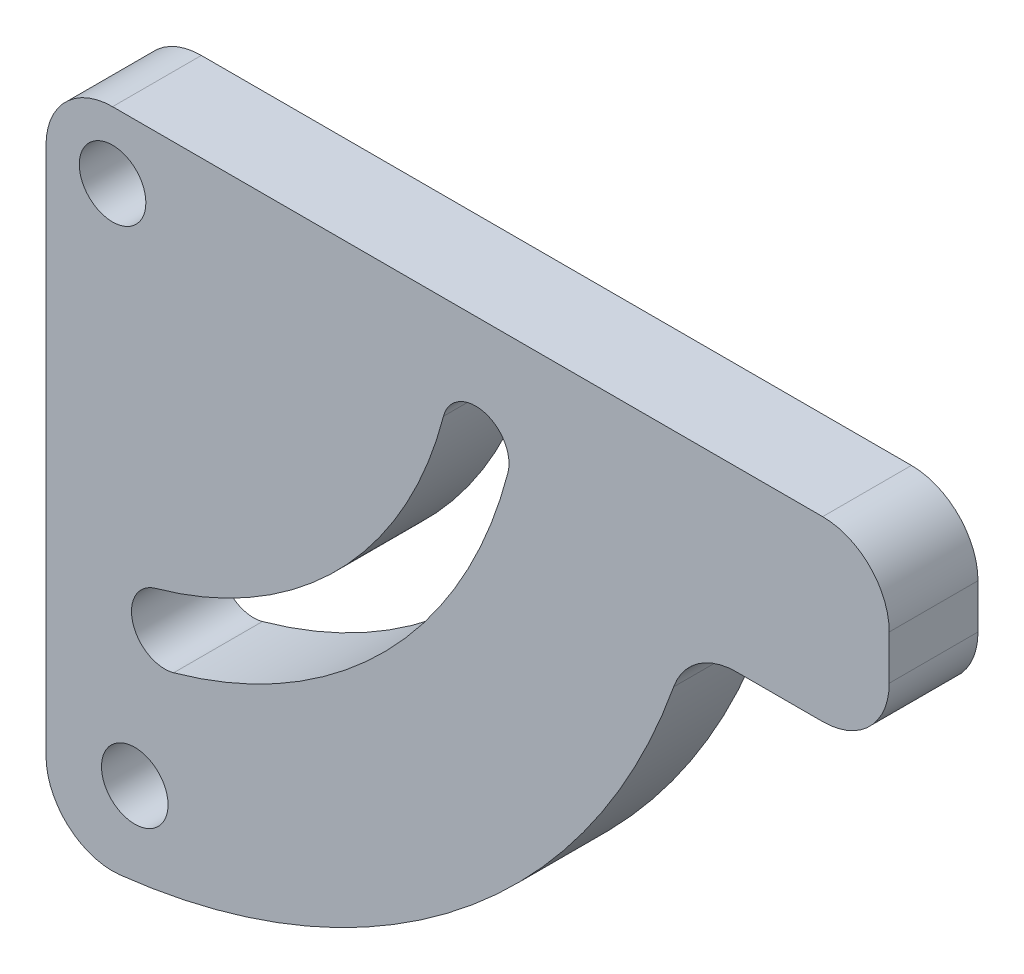
ISO-10303-21;
HEADER;
FILE_DESCRIPTION(('STEP AP214'),'2;1');
FILE_NAME('part.step','',(''),(''),'','','');
FILE_SCHEMA(('AUTOMOTIVE_DESIGN { 1 0 10303 214 1 1 1 1 }'));
ENDSEC;
DATA;
#1=APPLICATION_CONTEXT('core data for automotive mechanical design processes');
#2=APPLICATION_PROTOCOL_DEFINITION('international standard','automotive_design',2000,#1);
#3=PRODUCT_CONTEXT('',#1,'mechanical');
#4=PRODUCT('Part','Part','',(#3));
#5=PRODUCT_RELATED_PRODUCT_CATEGORY('part','',(#4));
#6=PRODUCT_DEFINITION_FORMATION('','',#4);
#7=PRODUCT_DEFINITION_CONTEXT('part definition',#1,'design');
#8=PRODUCT_DEFINITION('design','',#6,#7);
#9=PRODUCT_DEFINITION_SHAPE('','',#8);
#10=(LENGTH_UNIT() NAMED_UNIT(*) SI_UNIT(.MILLI.,.METRE.));
#11=(NAMED_UNIT(*) PLANE_ANGLE_UNIT() SI_UNIT($,.RADIAN.));
#12=(NAMED_UNIT(*) SI_UNIT($,.STERADIAN.) SOLID_ANGLE_UNIT());
#13=UNCERTAINTY_MEASURE_WITH_UNIT(LENGTH_MEASURE(1.E-05),#10,'distance_accuracy_value','');
#14=(GEOMETRIC_REPRESENTATION_CONTEXT(3) GLOBAL_UNCERTAINTY_ASSIGNED_CONTEXT((#13)) GLOBAL_UNIT_ASSIGNED_CONTEXT((#10,
#11,#12)) REPRESENTATION_CONTEXT('',''));
#15=CARTESIAN_POINT('',(0.,0.,0.));
#16=DIRECTION('',(0.,0.,1.));
#17=DIRECTION('',(1.,0.,0.));
#18=AXIS2_PLACEMENT_3D('',#15,#16,#17);
#19=CARTESIAN_POINT('',(0.,0.,4.));
#20=DIRECTION('',(0.,0.,1.));
#21=DIRECTION('',(1.,0.,0.));
#22=AXIS2_PLACEMENT_3D('',#19,#20,#21);
#23=PLANE('',#22);
#24=CARTESIAN_POINT('',(5.35233134659635,-19.2705098312484,4.));
#25=DIRECTION('',(0.,0.,1.));
#26=DIRECTION('',(1.,0.,0.));
#27=AXIS2_PLACEMENT_3D('',#24,#25,#26);
#28=CIRCLE('',#27,1.5);
#29=CARTESIAN_POINT('',(4.95090649560162,-17.8252215939048,4.));
#30=VERTEX_POINT('',#29);
#31=CARTESIAN_POINT('',(5.75375619759107,-20.7157980685921,4.));
#32=VERTEX_POINT('',#31);
#33=EDGE_CURVE('E146',#30,#32,#28,.T.);
#34=ORIENTED_EDGE('',*,*,#33,.F.);
#35=CARTESIAN_POINT('',(0.,0.,4.));
#36=DIRECTION('',(0.,0.,-1.));
#37=DIRECTION('',(1.,0.,0.));
#38=AXIS2_PLACEMENT_3D('',#35,#36,#37);
#39=CIRCLE('',#38,18.5);
#40=CARTESIAN_POINT('',(17.9125479762093,-4.625,4.));
#41=VERTEX_POINT('',#40);
#42=EDGE_CURVE('E136',#41,#30,#39,.T.);
#43=ORIENTED_EDGE('',*,*,#42,.F.);
#44=CARTESIAN_POINT('',(19.3649167310371,-5.,4.));
#45=DIRECTION('',(0.,0.,1.));
#46=DIRECTION('',(1.,0.,0.));
#47=AXIS2_PLACEMENT_3D('',#44,#45,#46);
#48=CIRCLE('',#47,1.5);
#49=CARTESIAN_POINT('',(20.8172854858649,-5.37500000000001,4.));
#50=VERTEX_POINT('',#49);
#51=EDGE_CURVE('E162',#50,#41,#48,.T.);
#52=ORIENTED_EDGE('',*,*,#51,.F.);
#53=CARTESIAN_POINT('',(0.,0.,4.));
#54=DIRECTION('',(0.,0.,1.));
#55=DIRECTION('',(1.,0.,0.));
#56=AXIS2_PLACEMENT_3D('',#53,#54,#55);
#57=CIRCLE('',#56,21.5);
#58=EDGE_CURVE('E160',#32,#50,#57,.T.);
#59=ORIENTED_EDGE('',*,*,#58,.F.);
#60=EDGE_LOOP('',(#34,#43,#52,#59));
#61=FACE_BOUND('',#60,.T.);
#62=CARTESIAN_POINT('',(4.,-26.,4.));
#63=DIRECTION('',(0.,0.,1.));
#64=DIRECTION('',(1.,0.,0.));
#65=AXIS2_PLACEMENT_3D('',#62,#63,#64);
#66=CIRCLE('',#65,1.5);
#67=CARTESIAN_POINT('',(5.5,-26.,4.));
#68=VERTEX_POINT('',#67);
#69=EDGE_CURVE('E180',#68,#68,#66,.T.);
#70=ORIENTED_EDGE('',*,*,#69,.F.);
#71=EDGE_LOOP('',(#70));
#72=FACE_BOUND('',#71,.T.);
#73=DIRECTION('',(0.,-1.,0.));
#74=VECTOR('',#73,1.);
#75=CARTESIAN_POINT('',(0.,0.,4.));
#76=LINE('',#75,#74);
#77=CARTESIAN_POINT('',(0.,-3.,4.));
#78=VERTEX_POINT('',#77);
#79=CARTESIAN_POINT('',(0.,-26.8328157299975,4.));
#80=VERTEX_POINT('',#79);
#81=EDGE_CURVE('E186',#78,#80,#76,.T.);
#82=ORIENTED_EDGE('',*,*,#81,.T.);
#83=CARTESIAN_POINT('',(3.,-26.8328157299975,4.));
#84=DIRECTION('',(0.,0.,1.));
#85=DIRECTION('',(1.,0.,0.));
#86=AXIS2_PLACEMENT_3D('',#83,#84,#85);
#87=CIRCLE('',#86,3.);
#88=CARTESIAN_POINT('',(3.33333333333334,-29.8142396999972,4.));
#89=VERTEX_POINT('',#88);
#90=EDGE_CURVE('E235',#80,#89,#87,.T.);
#91=ORIENTED_EDGE('',*,*,#90,.T.);
#92=CARTESIAN_POINT('',(0.,0.,4.));
#93=DIRECTION('',(0.,0.,1.));
#94=DIRECTION('',(1.,0.,0.));
#95=AXIS2_PLACEMENT_3D('',#92,#93,#94);
#96=CIRCLE('',#95,30.);
#97=CARTESIAN_POINT('',(28.2842712474619,-10.,4.));
#98=VERTEX_POINT('',#97);
#99=EDGE_CURVE('E189',#89,#98,#96,.T.);
#100=ORIENTED_EDGE('',*,*,#99,.T.);
#101=CARTESIAN_POINT('',(31.1126983722081,-11.,4.));
#102=DIRECTION('',(0.,0.,1.));
#103=DIRECTION('',(1.,0.,0.));
#104=AXIS2_PLACEMENT_3D('',#101,#102,#103);
#105=CIRCLE('',#104,3.);
#106=CARTESIAN_POINT('',(31.1126983722081,-8.,4.));
#107=VERTEX_POINT('',#106);
#108=EDGE_CURVE('E11',#98,#107,#105,.F.);
#109=ORIENTED_EDGE('',*,*,#108,.T.);
#110=DIRECTION('',(1.,0.,0.));
#111=VECTOR('',#110,1.);
#112=CARTESIAN_POINT('',(28.9136645896019,-8.,4.));
#113=LINE('',#112,#111);
#114=CARTESIAN_POINT('',(35.,-8.,4.));
#115=VERTEX_POINT('',#114);
#116=EDGE_CURVE('E193',#107,#115,#113,.T.);
#117=ORIENTED_EDGE('',*,*,#116,.T.);
#118=CARTESIAN_POINT('',(35.,-5.,4.));
#119=DIRECTION('',(0.,0.,1.));
#120=DIRECTION('',(1.,0.,0.));
#121=AXIS2_PLACEMENT_3D('',#118,#119,#120);
#122=CIRCLE('',#121,3.);
#123=CARTESIAN_POINT('',(38.,-5.,4.));
#124=VERTEX_POINT('',#123);
#125=EDGE_CURVE('E233',#115,#124,#122,.T.);
#126=ORIENTED_EDGE('',*,*,#125,.T.);
#127=DIRECTION('',(0.,1.,0.));
#128=VECTOR('',#127,1.);
#129=CARTESIAN_POINT('',(38.,-8.,4.));
#130=LINE('',#129,#128);
#131=CARTESIAN_POINT('',(38.,-3.,4.));
#132=VERTEX_POINT('',#131);
#133=EDGE_CURVE('E196',#124,#132,#130,.T.);
#134=ORIENTED_EDGE('',*,*,#133,.T.);
#135=CARTESIAN_POINT('',(35.,-3.,4.));
#136=DIRECTION('',(0.,0.,1.));
#137=DIRECTION('',(1.,0.,0.));
#138=AXIS2_PLACEMENT_3D('',#135,#136,#137);
#139=CIRCLE('',#138,3.);
#140=CARTESIAN_POINT('',(35.,0.,4.));
#141=VERTEX_POINT('',#140);
#142=EDGE_CURVE('E55',#132,#141,#139,.T.);
#143=ORIENTED_EDGE('',*,*,#142,.T.);
#144=DIRECTION('',(-1.,0.,0.));
#145=VECTOR('',#144,1.);
#146=CARTESIAN_POINT('',(38.,0.,4.));
#147=LINE('',#146,#145);
#148=CARTESIAN_POINT('',(3.,0.,4.));
#149=VERTEX_POINT('',#148);
#150=EDGE_CURVE('E198',#141,#149,#147,.T.);
#151=ORIENTED_EDGE('',*,*,#150,.T.);
#152=CARTESIAN_POINT('',(3.,-3.,4.));
#153=DIRECTION('',(0.,0.,1.));
#154=DIRECTION('',(1.,0.,0.));
#155=AXIS2_PLACEMENT_3D('',#152,#153,#154);
#156=CIRCLE('',#155,3.);
#157=EDGE_CURVE('E230',#149,#78,#156,.T.);
#158=ORIENTED_EDGE('',*,*,#157,.T.);
#159=EDGE_LOOP('',(#82,#91,#100,#109,#117,#126,#134,#143,#151,#158));
#160=FACE_BOUND('',#159,.T.);
#161=CARTESIAN_POINT('',(3.,-3.,4.));
#162=DIRECTION('',(0.,0.,1.));
#163=DIRECTION('',(1.,0.,0.));
#164=AXIS2_PLACEMENT_3D('',#161,#162,#163);
#165=CIRCLE('',#164,1.5);
#166=CARTESIAN_POINT('',(4.5,-3.,4.));
#167=VERTEX_POINT('',#166);
#168=EDGE_CURVE('E169',#167,#167,#165,.T.);
#169=ORIENTED_EDGE('',*,*,#168,.F.);
#170=EDGE_LOOP('',(#169));
#171=FACE_BOUND('',#170,.T.);
#172=ADVANCED_FACE('F33',(#61,#72,#160,#171),#23,.T.);
#173=CARTESIAN_POINT('',(0.,0.,0.));
#174=DIRECTION('',(0.,0.,1.));
#175=DIRECTION('',(1.,0.,0.));
#176=AXIS2_PLACEMENT_3D('',#173,#174,#175);
#177=PLANE('',#176);
#178=CARTESIAN_POINT('',(4.,-26.,0.));
#179=DIRECTION('',(0.,0.,1.));
#180=DIRECTION('',(1.,0.,0.));
#181=AXIS2_PLACEMENT_3D('',#178,#179,#180);
#182=CIRCLE('',#181,1.5);
#183=CARTESIAN_POINT('',(5.5,-26.,0.));
#184=VERTEX_POINT('',#183);
#185=EDGE_CURVE('E154',#184,#184,#182,.T.);
#186=ORIENTED_EDGE('',*,*,#185,.T.);
#187=EDGE_LOOP('',(#186));
#188=FACE_BOUND('',#187,.T.);
#189=CARTESIAN_POINT('',(0.,0.,0.));
#190=DIRECTION('',(0.,0.,1.));
#191=DIRECTION('',(1.,0.,0.));
#192=AXIS2_PLACEMENT_3D('',#189,#190,#191);
#193=CIRCLE('',#192,30.);
#194=CARTESIAN_POINT('',(3.33333333333334,-29.8142396999972,0.));
#195=VERTEX_POINT('',#194);
#196=CARTESIAN_POINT('',(28.2842712474619,-10.,0.));
#197=VERTEX_POINT('',#196);
#198=EDGE_CURVE('E203',#195,#197,#193,.T.);
#199=ORIENTED_EDGE('',*,*,#198,.F.);
#200=CARTESIAN_POINT('',(3.,-26.8328157299975,0.));
#201=DIRECTION('',(0.,0.,1.));
#202=DIRECTION('',(1.,0.,0.));
#203=AXIS2_PLACEMENT_3D('',#200,#201,#202);
#204=CIRCLE('',#203,3.);
#205=CARTESIAN_POINT('',(0.,-26.8328157299975,0.));
#206=VERTEX_POINT('',#205);
#207=EDGE_CURVE('E223',#195,#206,#204,.F.);
#208=ORIENTED_EDGE('',*,*,#207,.T.);
#209=DIRECTION('',(0.,-1.,0.));
#210=VECTOR('',#209,1.);
#211=CARTESIAN_POINT('',(0.,0.,0.));
#212=LINE('',#211,#210);
#213=CARTESIAN_POINT('',(0.,-3.,0.));
#214=VERTEX_POINT('',#213);
#215=EDGE_CURVE('E183',#214,#206,#212,.T.);
#216=ORIENTED_EDGE('',*,*,#215,.F.);
#217=CARTESIAN_POINT('',(3.,-3.,0.));
#218=DIRECTION('',(0.,0.,1.));
#219=DIRECTION('',(1.,0.,0.));
#220=AXIS2_PLACEMENT_3D('',#217,#218,#219);
#221=CIRCLE('',#220,3.);
#222=CARTESIAN_POINT('',(3.,0.,0.));
#223=VERTEX_POINT('',#222);
#224=EDGE_CURVE('E217',#214,#223,#221,.F.);
#225=ORIENTED_EDGE('',*,*,#224,.T.);
#226=DIRECTION('',(-1.,0.,0.));
#227=VECTOR('',#226,1.);
#228=CARTESIAN_POINT('',(0.,0.,0.));
#229=LINE('',#228,#227);
#230=CARTESIAN_POINT('',(35.,0.,0.));
#231=VERTEX_POINT('',#230);
#232=EDGE_CURVE('E190',#231,#223,#229,.T.);
#233=ORIENTED_EDGE('',*,*,#232,.F.);
#234=CARTESIAN_POINT('',(35.,-3.,0.));
#235=DIRECTION('',(0.,0.,1.));
#236=DIRECTION('',(1.,0.,0.));
#237=AXIS2_PLACEMENT_3D('',#234,#235,#236);
#238=CIRCLE('',#237,3.);
#239=CARTESIAN_POINT('',(38.,-3.,0.));
#240=VERTEX_POINT('',#239);
#241=EDGE_CURVE('E219',#231,#240,#238,.F.);
#242=ORIENTED_EDGE('',*,*,#241,.T.);
#243=DIRECTION('',(0.,1.,0.));
#244=VECTOR('',#243,1.);
#245=CARTESIAN_POINT('',(38.,-8.,0.));
#246=LINE('',#245,#244);
#247=CARTESIAN_POINT('',(38.,-5.,0.));
#248=VERTEX_POINT('',#247);
#249=EDGE_CURVE('E209',#248,#240,#246,.T.);
#250=ORIENTED_EDGE('',*,*,#249,.F.);
#251=CARTESIAN_POINT('',(35.,-5.,0.));
#252=DIRECTION('',(0.,0.,1.));
#253=DIRECTION('',(1.,0.,0.));
#254=AXIS2_PLACEMENT_3D('',#251,#252,#253);
#255=CIRCLE('',#254,3.);
#256=CARTESIAN_POINT('',(35.,-8.,0.));
#257=VERTEX_POINT('',#256);
#258=EDGE_CURVE('E221',#248,#257,#255,.F.);
#259=ORIENTED_EDGE('',*,*,#258,.T.);
#260=DIRECTION('',(1.,0.,0.));
#261=VECTOR('',#260,1.);
#262=CARTESIAN_POINT('',(28.9136645896019,-8.,0.));
#263=LINE('',#262,#261);
#264=CARTESIAN_POINT('',(31.1126983722081,-8.,0.));
#265=VERTEX_POINT('',#264);
#266=EDGE_CURVE('E206',#265,#257,#263,.T.);
#267=ORIENTED_EDGE('',*,*,#266,.F.);
#268=CARTESIAN_POINT('',(31.1126983722081,-11.,0.));
#269=DIRECTION('',(0.,0.,1.));
#270=DIRECTION('',(1.,0.,0.));
#271=AXIS2_PLACEMENT_3D('',#268,#269,#270);
#272=CIRCLE('',#271,3.);
#273=EDGE_CURVE('E41',#265,#197,#272,.T.);
#274=ORIENTED_EDGE('',*,*,#273,.T.);
#275=EDGE_LOOP('',(#199,#208,#216,#225,#233,#242,#250,#259,#267,#274));
#276=FACE_BOUND('',#275,.T.);
#277=CARTESIAN_POINT('',(0.,0.,0.));
#278=DIRECTION('',(0.,0.,-1.));
#279=DIRECTION('',(1.,0.,0.));
#280=AXIS2_PLACEMENT_3D('',#277,#278,#279);
#281=CIRCLE('',#280,18.5);
#282=CARTESIAN_POINT('',(17.9125479762093,-4.625,0.));
#283=VERTEX_POINT('',#282);
#284=CARTESIAN_POINT('',(4.95090649560162,-17.8252215939048,0.));
#285=VERTEX_POINT('',#284);
#286=EDGE_CURVE('E167',#283,#285,#281,.T.);
#287=ORIENTED_EDGE('',*,*,#286,.T.);
#288=CARTESIAN_POINT('',(5.35233134659635,-19.2705098312484,0.));
#289=DIRECTION('',(0.,0.,1.));
#290=DIRECTION('',(1.,0.,0.));
#291=AXIS2_PLACEMENT_3D('',#288,#289,#290);
#292=CIRCLE('',#291,1.5);
#293=CARTESIAN_POINT('',(5.75375619759107,-20.7157980685921,0.));
#294=VERTEX_POINT('',#293);
#295=EDGE_CURVE('E153',#285,#294,#292,.T.);
#296=ORIENTED_EDGE('',*,*,#295,.T.);
#297=CARTESIAN_POINT('',(0.,0.,0.));
#298=DIRECTION('',(0.,0.,1.));
#299=DIRECTION('',(1.,0.,0.));
#300=AXIS2_PLACEMENT_3D('',#297,#298,#299);
#301=CIRCLE('',#300,21.5);
#302=CARTESIAN_POINT('',(20.8172854858649,-5.37500000000001,0.));
#303=VERTEX_POINT('',#302);
#304=EDGE_CURVE('E171',#294,#303,#301,.T.);
#305=ORIENTED_EDGE('',*,*,#304,.T.);
#306=CARTESIAN_POINT('',(19.3649167310371,-5.,0.));
#307=DIRECTION('',(0.,0.,1.));
#308=DIRECTION('',(1.,0.,0.));
#309=AXIS2_PLACEMENT_3D('',#306,#307,#308);
#310=CIRCLE('',#309,1.5);
#311=EDGE_CURVE('E147',#303,#283,#310,.T.);
#312=ORIENTED_EDGE('',*,*,#311,.T.);
#313=EDGE_LOOP('',(#287,#296,#305,#312));
#314=FACE_BOUND('',#313,.T.);
#315=CARTESIAN_POINT('',(3.,-3.,0.));
#316=DIRECTION('',(0.,0.,1.));
#317=DIRECTION('',(1.,0.,0.));
#318=AXIS2_PLACEMENT_3D('',#315,#316,#317);
#319=CIRCLE('',#318,1.5);
#320=CARTESIAN_POINT('',(4.5,-3.,0.));
#321=VERTEX_POINT('',#320);
#322=EDGE_CURVE('E453',#321,#321,#319,.T.);
#323=ORIENTED_EDGE('',*,*,#322,.T.);
#324=EDGE_LOOP('',(#323));
#325=FACE_BOUND('',#324,.T.);
#326=ADVANCED_FACE('F253',(#188,#276,#314,#325),#177,.F.);
#327=CARTESIAN_POINT('',(0.,0.,4.));
#328=DIRECTION('',(1.,0.,0.));
#329=DIRECTION('',(0.,1.,0.));
#330=AXIS2_PLACEMENT_3D('',#327,#328,#329);
#331=PLANE('',#330);
#332=ORIENTED_EDGE('',*,*,#215,.T.);
#333=DIRECTION('',(0.,0.,-1.));
#334=VECTOR('',#333,1.);
#335=CARTESIAN_POINT('',(0.,-26.8328157299975,4.));
#336=LINE('',#335,#334);
#337=EDGE_CURVE('E228',#206,#80,#336,.F.);
#338=ORIENTED_EDGE('',*,*,#337,.T.);
#339=ORIENTED_EDGE('',*,*,#81,.F.);
#340=DIRECTION('',(0.,0.,-1.));
#341=VECTOR('',#340,1.);
#342=CARTESIAN_POINT('',(0.,-3.,4.));
#343=LINE('',#342,#341);
#344=EDGE_CURVE('E225',#78,#214,#343,.T.);
#345=ORIENTED_EDGE('',*,*,#344,.T.);
#346=EDGE_LOOP('',(#332,#338,#339,#345));
#347=FACE_BOUND('',#346,.T.);
#348=ADVANCED_FACE('F289',(#347),#331,.F.);
#349=CARTESIAN_POINT('',(0.,0.,4.));
#350=DIRECTION('',(0.,0.,-1.));
#351=DIRECTION('',(-1.,0.,0.));
#352=AXIS2_PLACEMENT_3D('',#349,#350,#351);
#353=CYLINDRICAL_SURFACE('',#352,30.);
#354=ORIENTED_EDGE('',*,*,#99,.F.);
#355=DIRECTION('',(0.,0.,-1.));
#356=VECTOR('',#355,1.);
#357=CARTESIAN_POINT('',(3.33333333333334,-29.8142396999972,4.));
#358=LINE('',#357,#356);
#359=EDGE_CURVE('E214',#89,#195,#358,.T.);
#360=ORIENTED_EDGE('',*,*,#359,.T.);
#361=ORIENTED_EDGE('',*,*,#198,.T.);
#362=DIRECTION('',(0.,0.,-1.));
#363=VECTOR('',#362,1.);
#364=CARTESIAN_POINT('',(28.2842712474619,-10.,4.));
#365=LINE('',#364,#363);
#366=EDGE_CURVE('E200',#197,#98,#365,.F.);
#367=ORIENTED_EDGE('',*,*,#366,.T.);
#368=EDGE_LOOP('',(#354,#360,#361,#367));
#369=FACE_BOUND('',#368,.T.);
#370=ADVANCED_FACE('F260',(#369),#353,.T.);
#371=CARTESIAN_POINT('',(28.9136645896019,-8.,4.));
#372=DIRECTION('',(0.,1.,0.));
#373=DIRECTION('',(0.,0.,1.));
#374=AXIS2_PLACEMENT_3D('',#371,#372,#373);
#375=PLANE('',#374);
#376=ORIENTED_EDGE('',*,*,#266,.T.);
#377=DIRECTION('',(0.,0.,-1.));
#378=VECTOR('',#377,1.);
#379=CARTESIAN_POINT('',(35.,-8.,4.));
#380=LINE('',#379,#378);
#381=EDGE_CURVE('E245',#257,#115,#380,.F.);
#382=ORIENTED_EDGE('',*,*,#381,.T.);
#383=ORIENTED_EDGE('',*,*,#116,.F.);
#384=DIRECTION('',(0.,0.,1.));
#385=VECTOR('',#384,1.);
#386=CARTESIAN_POINT('',(31.1126983722081,-8.,0.));
#387=LINE('',#386,#385);
#388=EDGE_CURVE('E242',#107,#265,#387,.F.);
#389=ORIENTED_EDGE('',*,*,#388,.T.);
#390=EDGE_LOOP('',(#376,#382,#383,#389));
#391=FACE_BOUND('',#390,.T.);
#392=ADVANCED_FACE('F268',(#391),#375,.F.);
#393=CARTESIAN_POINT('',(38.,-8.,4.));
#394=DIRECTION('',(-1.,0.,0.));
#395=DIRECTION('',(0.,0.,1.));
#396=AXIS2_PLACEMENT_3D('',#393,#394,#395);
#397=PLANE('',#396);
#398=ORIENTED_EDGE('',*,*,#133,.F.);
#399=DIRECTION('',(0.,0.,-1.));
#400=VECTOR('',#399,1.);
#401=CARTESIAN_POINT('',(38.,-5.,4.));
#402=LINE('',#401,#400);
#403=EDGE_CURVE('E239',#124,#248,#402,.T.);
#404=ORIENTED_EDGE('',*,*,#403,.T.);
#405=ORIENTED_EDGE('',*,*,#249,.T.);
#406=DIRECTION('',(0.,0.,-1.));
#407=VECTOR('',#406,1.);
#408=CARTESIAN_POINT('',(38.,-3.,4.));
#409=LINE('',#408,#407);
#410=EDGE_CURVE('E237',#240,#132,#409,.F.);
#411=ORIENTED_EDGE('',*,*,#410,.T.);
#412=EDGE_LOOP('',(#398,#404,#405,#411));
#413=FACE_BOUND('',#412,.T.);
#414=ADVANCED_FACE('F275',(#413),#397,.F.);
#415=CARTESIAN_POINT('',(0.,0.,4.));
#416=DIRECTION('',(0.,-1.,0.));
#417=DIRECTION('',(1.,0.,0.));
#418=AXIS2_PLACEMENT_3D('',#415,#416,#417);
#419=PLANE('',#418);
#420=ORIENTED_EDGE('',*,*,#150,.F.);
#421=DIRECTION('',(0.,0.,-1.));
#422=VECTOR('',#421,1.);
#423=CARTESIAN_POINT('',(35.,0.,4.));
#424=LINE('',#423,#422);
#425=EDGE_CURVE('E248',#141,#231,#424,.T.);
#426=ORIENTED_EDGE('',*,*,#425,.T.);
#427=ORIENTED_EDGE('',*,*,#232,.T.);
#428=DIRECTION('',(0.,0.,-1.));
#429=VECTOR('',#428,1.);
#430=CARTESIAN_POINT('',(3.,0.,4.));
#431=LINE('',#430,#429);
#432=EDGE_CURVE('E48',#223,#149,#431,.F.);
#433=ORIENTED_EDGE('',*,*,#432,.T.);
#434=EDGE_LOOP('',(#420,#426,#427,#433));
#435=FACE_BOUND('',#434,.T.);
#436=ADVANCED_FACE('F282',(#435),#419,.F.);
#437=CARTESIAN_POINT('',(4.,-26.,4.));
#438=DIRECTION('',(0.,0.,-1.));
#439=DIRECTION('',(-1.,0.,0.));
#440=AXIS2_PLACEMENT_3D('',#437,#438,#439);
#441=CYLINDRICAL_SURFACE('',#440,1.5);
#442=ORIENTED_EDGE('',*,*,#69,.T.);
#443=EDGE_LOOP('',(#442));
#444=FACE_BOUND('',#443,.T.);
#445=ORIENTED_EDGE('',*,*,#185,.F.);
#446=EDGE_LOOP('',(#445));
#447=FACE_BOUND('',#446,.T.);
#448=ADVANCED_FACE('F314',(#444,#447),#441,.F.);
#449=CARTESIAN_POINT('',(0.,0.,4.));
#450=DIRECTION('',(0.,0.,-1.));
#451=DIRECTION('',(-1.,0.,0.));
#452=AXIS2_PLACEMENT_3D('',#449,#450,#451);
#453=CYLINDRICAL_SURFACE('',#452,18.5);
#454=ORIENTED_EDGE('',*,*,#286,.F.);
#455=DIRECTION('',(0.,0.,-1.));
#456=VECTOR('',#455,1.);
#457=CARTESIAN_POINT('',(17.9125479762093,-4.625,4.));
#458=LINE('',#457,#456);
#459=EDGE_CURVE('E142',#41,#283,#458,.T.);
#460=ORIENTED_EDGE('',*,*,#459,.F.);
#461=ORIENTED_EDGE('',*,*,#42,.T.);
#462=DIRECTION('',(0.,0.,-1.));
#463=VECTOR('',#462,1.);
#464=CARTESIAN_POINT('',(4.95090649560162,-17.8252215939048,4.));
#465=LINE('',#464,#463);
#466=EDGE_CURVE('E139',#30,#285,#465,.T.);
#467=ORIENTED_EDGE('',*,*,#466,.T.);
#468=EDGE_LOOP('',(#454,#460,#461,#467));
#469=FACE_BOUND('',#468,.T.);
#470=ADVANCED_FACE('F138',(#469),#453,.T.);
#471=CARTESIAN_POINT('',(5.35233134659635,-19.2705098312484,4.));
#472=DIRECTION('',(0.,0.,-1.));
#473=DIRECTION('',(-1.,0.,0.));
#474=AXIS2_PLACEMENT_3D('',#471,#472,#473);
#475=CYLINDRICAL_SURFACE('',#474,1.5);
#476=ORIENTED_EDGE('',*,*,#295,.F.);
#477=ORIENTED_EDGE('',*,*,#466,.F.);
#478=ORIENTED_EDGE('',*,*,#33,.T.);
#479=DIRECTION('',(0.,0.,-1.));
#480=VECTOR('',#479,1.);
#481=CARTESIAN_POINT('',(5.75375619759107,-20.7157980685921,4.));
#482=LINE('',#481,#480);
#483=EDGE_CURVE('E155',#32,#294,#482,.T.);
#484=ORIENTED_EDGE('',*,*,#483,.T.);
#485=EDGE_LOOP('',(#476,#477,#478,#484));
#486=FACE_BOUND('',#485,.T.);
#487=ADVANCED_FACE('F150',(#486),#475,.F.);
#488=CARTESIAN_POINT('',(0.,0.,4.));
#489=DIRECTION('',(0.,0.,-1.));
#490=DIRECTION('',(-1.,0.,0.));
#491=AXIS2_PLACEMENT_3D('',#488,#489,#490);
#492=CYLINDRICAL_SURFACE('',#491,21.5);
#493=ORIENTED_EDGE('',*,*,#304,.F.);
#494=ORIENTED_EDGE('',*,*,#483,.F.);
#495=ORIENTED_EDGE('',*,*,#58,.T.);
#496=DIRECTION('',(0.,0.,-1.));
#497=VECTOR('',#496,1.);
#498=CARTESIAN_POINT('',(20.8172854858649,-5.37500000000001,4.));
#499=LINE('',#498,#497);
#500=EDGE_CURVE('E177',#50,#303,#499,.T.);
#501=ORIENTED_EDGE('',*,*,#500,.T.);
#502=EDGE_LOOP('',(#493,#494,#495,#501));
#503=FACE_BOUND('',#502,.T.);
#504=ADVANCED_FACE('F362',(#503),#492,.F.);
#505=CARTESIAN_POINT('',(19.3649167310371,-5.,4.));
#506=DIRECTION('',(0.,0.,-1.));
#507=DIRECTION('',(-1.,0.,0.));
#508=AXIS2_PLACEMENT_3D('',#505,#506,#507);
#509=CYLINDRICAL_SURFACE('',#508,1.5);
#510=ORIENTED_EDGE('',*,*,#311,.F.);
#511=ORIENTED_EDGE('',*,*,#500,.F.);
#512=ORIENTED_EDGE('',*,*,#51,.T.);
#513=ORIENTED_EDGE('',*,*,#459,.T.);
#514=EDGE_LOOP('',(#510,#511,#512,#513));
#515=FACE_BOUND('',#514,.T.);
#516=ADVANCED_FACE('F302',(#515),#509,.F.);
#517=CARTESIAN_POINT('',(3.,-3.,4.));
#518=DIRECTION('',(0.,0.,-1.));
#519=DIRECTION('',(-1.,0.,0.));
#520=AXIS2_PLACEMENT_3D('',#517,#518,#519);
#521=CYLINDRICAL_SURFACE('',#520,1.5);
#522=ORIENTED_EDGE('',*,*,#168,.T.);
#523=EDGE_LOOP('',(#522));
#524=FACE_BOUND('',#523,.T.);
#525=ORIENTED_EDGE('',*,*,#322,.F.);
#526=EDGE_LOOP('',(#525));
#527=FACE_BOUND('',#526,.T.);
#528=ADVANCED_FACE('F295',(#524,#527),#521,.F.);
#529=CARTESIAN_POINT('',(3.,-26.8328157299975,4.));
#530=DIRECTION('',(0.,0.,-1.));
#531=DIRECTION('',(-1.,0.,0.));
#532=AXIS2_PLACEMENT_3D('',#529,#530,#531);
#533=CYLINDRICAL_SURFACE('',#532,3.);
#534=ORIENTED_EDGE('',*,*,#90,.F.);
#535=ORIENTED_EDGE('',*,*,#337,.F.);
#536=ORIENTED_EDGE('',*,*,#207,.F.);
#537=ORIENTED_EDGE('',*,*,#359,.F.);
#538=EDGE_LOOP('',(#534,#535,#536,#537));
#539=FACE_BOUND('',#538,.T.);
#540=ADVANCED_FACE('F293',(#539),#533,.T.);
#541=CARTESIAN_POINT('',(35.,-5.,4.));
#542=DIRECTION('',(0.,0.,-1.));
#543=DIRECTION('',(-1.,0.,0.));
#544=AXIS2_PLACEMENT_3D('',#541,#542,#543);
#545=CYLINDRICAL_SURFACE('',#544,3.);
#546=ORIENTED_EDGE('',*,*,#125,.F.);
#547=ORIENTED_EDGE('',*,*,#381,.F.);
#548=ORIENTED_EDGE('',*,*,#258,.F.);
#549=ORIENTED_EDGE('',*,*,#403,.F.);
#550=EDGE_LOOP('',(#546,#547,#548,#549));
#551=FACE_BOUND('',#550,.T.);
#552=ADVANCED_FACE('F271',(#551),#545,.T.);
#553=CARTESIAN_POINT('',(31.1126983722081,-11.,4.));
#554=DIRECTION('',(0.,0.,-1.));
#555=DIRECTION('',(-1.,0.,0.));
#556=AXIS2_PLACEMENT_3D('',#553,#554,#555);
#557=CYLINDRICAL_SURFACE('',#556,3.);
#558=ORIENTED_EDGE('',*,*,#108,.F.);
#559=ORIENTED_EDGE('',*,*,#366,.F.);
#560=ORIENTED_EDGE('',*,*,#273,.F.);
#561=ORIENTED_EDGE('',*,*,#388,.F.);
#562=EDGE_LOOP('',(#558,#559,#560,#561));
#563=FACE_BOUND('',#562,.T.);
#564=ADVANCED_FACE('F263',(#563),#557,.F.);
#565=CARTESIAN_POINT('',(35.,-3.,4.));
#566=DIRECTION('',(0.,0.,-1.));
#567=DIRECTION('',(-1.,0.,0.));
#568=AXIS2_PLACEMENT_3D('',#565,#566,#567);
#569=CYLINDRICAL_SURFACE('',#568,3.);
#570=ORIENTED_EDGE('',*,*,#142,.F.);
#571=ORIENTED_EDGE('',*,*,#410,.F.);
#572=ORIENTED_EDGE('',*,*,#241,.F.);
#573=ORIENTED_EDGE('',*,*,#425,.F.);
#574=EDGE_LOOP('',(#570,#571,#572,#573));
#575=FACE_BOUND('',#574,.T.);
#576=ADVANCED_FACE('F279',(#575),#569,.T.);
#577=CARTESIAN_POINT('',(3.,-3.,4.));
#578=DIRECTION('',(0.,0.,-1.));
#579=DIRECTION('',(-1.,0.,0.));
#580=AXIS2_PLACEMENT_3D('',#577,#578,#579);
#581=CYLINDRICAL_SURFACE('',#580,3.);
#582=ORIENTED_EDGE('',*,*,#157,.F.);
#583=ORIENTED_EDGE('',*,*,#432,.F.);
#584=ORIENTED_EDGE('',*,*,#224,.F.);
#585=ORIENTED_EDGE('',*,*,#344,.F.);
#586=EDGE_LOOP('',(#582,#583,#584,#585));
#587=FACE_BOUND('',#586,.T.);
#588=ADVANCED_FACE('F35',(#587),#581,.T.);
#589=CLOSED_SHELL('',(#172,#326,#348,#370,#392,#414,#436,#448,#470,#487,#504,#516,#528,#540,
#552,#564,#576,#588));
#590=MANIFOLD_SOLID_BREP('B2',#589);
#591=ADVANCED_BREP_SHAPE_REPRESENTATION('',(#18,#590),#14);
#592=SHAPE_DEFINITION_REPRESENTATION(#9,#591);
ENDSEC;
END-ISO-10303-21;
